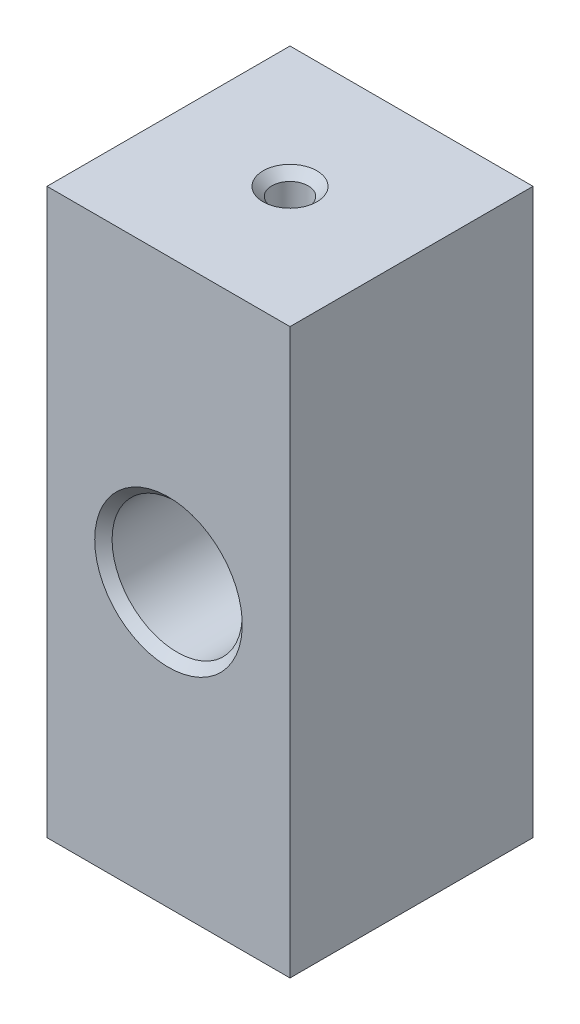
ISO-10303-21;
HEADER;
FILE_DESCRIPTION(('STEP AP214'),'2;1');
FILE_NAME('part.step','',(''),(''),'','','');
FILE_SCHEMA(('AUTOMOTIVE_DESIGN { 1 0 10303 214 1 1 1 1 }'));
ENDSEC;
DATA;
#1=APPLICATION_CONTEXT('core data for automotive mechanical design processes');
#2=APPLICATION_PROTOCOL_DEFINITION('international standard','automotive_design',2000,#1);
#3=PRODUCT_CONTEXT('',#1,'mechanical');
#4=PRODUCT('Part','Part','',(#3));
#5=PRODUCT_RELATED_PRODUCT_CATEGORY('part','',(#4));
#6=PRODUCT_DEFINITION_FORMATION('','',#4);
#7=PRODUCT_DEFINITION_CONTEXT('part definition',#1,'design');
#8=PRODUCT_DEFINITION('design','',#6,#7);
#9=PRODUCT_DEFINITION_SHAPE('','',#8);
#10=(LENGTH_UNIT() NAMED_UNIT(*) SI_UNIT(.MILLI.,.METRE.));
#11=(NAMED_UNIT(*) PLANE_ANGLE_UNIT() SI_UNIT($,.RADIAN.));
#12=(NAMED_UNIT(*) SI_UNIT($,.STERADIAN.) SOLID_ANGLE_UNIT());
#13=UNCERTAINTY_MEASURE_WITH_UNIT(LENGTH_MEASURE(1.E-05),#10,'distance_accuracy_value','');
#14=(GEOMETRIC_REPRESENTATION_CONTEXT(3) GLOBAL_UNCERTAINTY_ASSIGNED_CONTEXT((#13)) GLOBAL_UNIT_ASSIGNED_CONTEXT((#10,
#11,#12)) REPRESENTATION_CONTEXT('',''));
#15=CARTESIAN_POINT('',(0.,0.,0.));
#16=DIRECTION('',(0.,0.,1.));
#17=DIRECTION('',(1.,0.,0.));
#18=AXIS2_PLACEMENT_3D('',#15,#16,#17);
#19=CARTESIAN_POINT('',(0.,0.,28.));
#20=DIRECTION('',(0.,0.,-1.));
#21=DIRECTION('',(-1.,0.,0.));
#22=AXIS2_PLACEMENT_3D('',#19,#20,#21);
#23=PLANE('',#22);
#24=CARTESIAN_POINT('',(14.,32.5,28.));
#25=DIRECTION('',(0.,0.,-1.));
#26=DIRECTION('',(-1.,0.,0.));
#27=AXIS2_PLACEMENT_3D('',#24,#25,#26);
#28=CIRCLE('',#27,8.49999999999999);
#29=CARTESIAN_POINT('',(5.50000000000001,32.5,28.));
#30=VERTEX_POINT('',#29);
#31=EDGE_CURVE('E54',#30,#30,#28,.T.);
#32=ORIENTED_EDGE('',*,*,#31,.T.);
#33=EDGE_LOOP('',(#32));
#34=FACE_BOUND('',#33,.T.);
#35=DIRECTION('',(0.,-1.,0.));
#36=VECTOR('',#35,1.);
#37=CARTESIAN_POINT('',(0.,0.,28.));
#38=LINE('',#37,#36);
#39=CARTESIAN_POINT('',(0.,65.,28.));
#40=VERTEX_POINT('',#39);
#41=CARTESIAN_POINT('',(0.,0.,28.));
#42=VERTEX_POINT('',#41);
#43=EDGE_CURVE('E120',#40,#42,#38,.T.);
#44=ORIENTED_EDGE('',*,*,#43,.T.);
#45=DIRECTION('',(1.,0.,0.));
#46=VECTOR('',#45,1.);
#47=CARTESIAN_POINT('',(0.,0.,28.));
#48=LINE('',#47,#46);
#49=CARTESIAN_POINT('',(28.,0.,28.));
#50=VERTEX_POINT('',#49);
#51=EDGE_CURVE('E92',#42,#50,#48,.T.);
#52=ORIENTED_EDGE('',*,*,#51,.T.);
#53=DIRECTION('',(0.,1.,0.));
#54=VECTOR('',#53,1.);
#55=CARTESIAN_POINT('',(28.,0.,28.));
#56=LINE('',#55,#54);
#57=CARTESIAN_POINT('',(28.,65.,28.));
#58=VERTEX_POINT('',#57);
#59=EDGE_CURVE('E122',#50,#58,#56,.T.);
#60=ORIENTED_EDGE('',*,*,#59,.T.);
#61=DIRECTION('',(-1.,0.,0.));
#62=VECTOR('',#61,1.);
#63=CARTESIAN_POINT('',(0.,65.,28.));
#64=LINE('',#63,#62);
#65=EDGE_CURVE('E65',#58,#40,#64,.T.);
#66=ORIENTED_EDGE('',*,*,#65,.T.);
#67=EDGE_LOOP('',(#44,#52,#60,#66));
#68=FACE_BOUND('',#67,.T.);
#69=ADVANCED_FACE('F44',(#34,#68),#23,.F.);
#70=CARTESIAN_POINT('',(0.,0.,0.));
#71=DIRECTION('',(0.,0.,-1.));
#72=DIRECTION('',(-1.,0.,0.));
#73=AXIS2_PLACEMENT_3D('',#70,#71,#72);
#74=PLANE('',#73);
#75=CARTESIAN_POINT('',(14.,32.5,0.));
#76=DIRECTION('',(0.,0.,-1.));
#77=DIRECTION('',(-1.,0.,0.));
#78=AXIS2_PLACEMENT_3D('',#75,#76,#77);
#79=CIRCLE('',#78,8.49999999999999);
#80=CARTESIAN_POINT('',(5.50000000000001,32.5,0.));
#81=VERTEX_POINT('',#80);
#82=EDGE_CURVE('E11',#81,#81,#79,.F.);
#83=ORIENTED_EDGE('',*,*,#82,.T.);
#84=EDGE_LOOP('',(#83));
#85=FACE_BOUND('',#84,.T.);
#86=DIRECTION('',(0.,-1.,0.));
#87=VECTOR('',#86,1.);
#88=CARTESIAN_POINT('',(0.,0.,0.));
#89=LINE('',#88,#87);
#90=CARTESIAN_POINT('',(0.,65.,0.));
#91=VERTEX_POINT('',#90);
#92=CARTESIAN_POINT('',(0.,0.,0.));
#93=VERTEX_POINT('',#92);
#94=EDGE_CURVE('E113',#91,#93,#89,.T.);
#95=ORIENTED_EDGE('',*,*,#94,.F.);
#96=DIRECTION('',(-1.,0.,0.));
#97=VECTOR('',#96,1.);
#98=CARTESIAN_POINT('',(0.,65.,0.));
#99=LINE('',#98,#97);
#100=CARTESIAN_POINT('',(28.,65.,0.));
#101=VERTEX_POINT('',#100);
#102=EDGE_CURVE('E87',#101,#91,#99,.T.);
#103=ORIENTED_EDGE('',*,*,#102,.F.);
#104=DIRECTION('',(0.,1.,0.));
#105=VECTOR('',#104,1.);
#106=CARTESIAN_POINT('',(28.,0.,0.));
#107=LINE('',#106,#105);
#108=CARTESIAN_POINT('',(28.,0.,0.));
#109=VERTEX_POINT('',#108);
#110=EDGE_CURVE('E82',#109,#101,#107,.T.);
#111=ORIENTED_EDGE('',*,*,#110,.F.);
#112=DIRECTION('',(1.,0.,0.));
#113=VECTOR('',#112,1.);
#114=CARTESIAN_POINT('',(0.,0.,0.));
#115=LINE('',#114,#113);
#116=EDGE_CURVE('E130',#93,#109,#115,.T.);
#117=ORIENTED_EDGE('',*,*,#116,.F.);
#118=EDGE_LOOP('',(#95,#103,#111,#117));
#119=FACE_BOUND('',#118,.T.);
#120=ADVANCED_FACE('F180',(#85,#119),#74,.T.);
#121=CARTESIAN_POINT('',(0.,0.,28.));
#122=DIRECTION('',(1.,0.,0.));
#123=DIRECTION('',(0.,0.,-1.));
#124=AXIS2_PLACEMENT_3D('',#121,#122,#123);
#125=PLANE('',#124);
#126=ORIENTED_EDGE('',*,*,#94,.T.);
#127=DIRECTION('',(0.,0.,-1.));
#128=VECTOR('',#127,1.);
#129=CARTESIAN_POINT('',(0.,0.,28.));
#130=LINE('',#129,#128);
#131=EDGE_CURVE('E137',#42,#93,#130,.T.);
#132=ORIENTED_EDGE('',*,*,#131,.F.);
#133=ORIENTED_EDGE('',*,*,#43,.F.);
#134=DIRECTION('',(0.,0.,-1.));
#135=VECTOR('',#134,1.);
#136=CARTESIAN_POINT('',(0.,65.,28.));
#137=LINE('',#136,#135);
#138=EDGE_CURVE('E124',#40,#91,#137,.T.);
#139=ORIENTED_EDGE('',*,*,#138,.T.);
#140=EDGE_LOOP('',(#126,#132,#133,#139));
#141=FACE_BOUND('',#140,.T.);
#142=ADVANCED_FACE('F176',(#141),#125,.F.);
#143=CARTESIAN_POINT('',(0.,0.,28.));
#144=DIRECTION('',(0.,1.,0.));
#145=DIRECTION('',(0.,0.,1.));
#146=AXIS2_PLACEMENT_3D('',#143,#144,#145);
#147=PLANE('',#146);
#148=CARTESIAN_POINT('',(14.,0.,11.));
#149=DIRECTION('',(0.,1.,0.));
#150=DIRECTION('',(0.,0.,1.));
#151=AXIS2_PLACEMENT_3D('',#148,#149,#150);
#152=CIRCLE('',#151,3.09999999999999);
#153=CARTESIAN_POINT('',(14.,0.,14.1));
#154=VERTEX_POINT('',#153);
#155=EDGE_CURVE('E143',#154,#154,#152,.T.);
#156=ORIENTED_EDGE('',*,*,#155,.T.);
#157=EDGE_LOOP('',(#156));
#158=FACE_BOUND('',#157,.T.);
#159=ORIENTED_EDGE('',*,*,#116,.T.);
#160=DIRECTION('',(0.,0.,-1.));
#161=VECTOR('',#160,1.);
#162=CARTESIAN_POINT('',(28.,0.,28.));
#163=LINE('',#162,#161);
#164=EDGE_CURVE('E133',#50,#109,#163,.T.);
#165=ORIENTED_EDGE('',*,*,#164,.F.);
#166=ORIENTED_EDGE('',*,*,#51,.F.);
#167=ORIENTED_EDGE('',*,*,#131,.T.);
#168=EDGE_LOOP('',(#159,#165,#166,#167));
#169=FACE_BOUND('',#168,.T.);
#170=ADVANCED_FACE('F190',(#158,#169),#147,.F.);
#171=CARTESIAN_POINT('',(28.,0.,28.));
#172=DIRECTION('',(-1.,0.,0.));
#173=DIRECTION('',(0.,0.,1.));
#174=AXIS2_PLACEMENT_3D('',#171,#172,#173);
#175=PLANE('',#174);
#176=ORIENTED_EDGE('',*,*,#110,.T.);
#177=DIRECTION('',(0.,0.,-1.));
#178=VECTOR('',#177,1.);
#179=CARTESIAN_POINT('',(28.,65.,28.));
#180=LINE('',#179,#178);
#181=EDGE_CURVE('E131',#58,#101,#180,.T.);
#182=ORIENTED_EDGE('',*,*,#181,.F.);
#183=ORIENTED_EDGE('',*,*,#59,.F.);
#184=ORIENTED_EDGE('',*,*,#164,.T.);
#185=EDGE_LOOP('',(#176,#182,#183,#184));
#186=FACE_BOUND('',#185,.T.);
#187=ADVANCED_FACE('F186',(#186),#175,.F.);
#188=CARTESIAN_POINT('',(0.,65.,28.));
#189=DIRECTION('',(0.,-1.,0.));
#190=DIRECTION('',(0.,0.,-1.));
#191=AXIS2_PLACEMENT_3D('',#188,#189,#190);
#192=PLANE('',#191);
#193=CARTESIAN_POINT('',(14.,65.,14.));
#194=DIRECTION('',(0.,-1.,0.));
#195=DIRECTION('',(0.,0.,-1.));
#196=AXIS2_PLACEMENT_3D('',#193,#194,#195);
#197=CIRCLE('',#196,3.1);
#198=CARTESIAN_POINT('',(14.,65.,10.9));
#199=VERTEX_POINT('',#198);
#200=EDGE_CURVE('E150',#199,#199,#197,.T.);
#201=ORIENTED_EDGE('',*,*,#200,.T.);
#202=EDGE_LOOP('',(#201));
#203=FACE_BOUND('',#202,.T.);
#204=ORIENTED_EDGE('',*,*,#102,.T.);
#205=ORIENTED_EDGE('',*,*,#138,.F.);
#206=ORIENTED_EDGE('',*,*,#65,.F.);
#207=ORIENTED_EDGE('',*,*,#181,.T.);
#208=EDGE_LOOP('',(#204,#205,#206,#207));
#209=FACE_BOUND('',#208,.T.);
#210=ADVANCED_FACE('F166',(#203,#209),#192,.F.);
#211=CARTESIAN_POINT('',(14.,32.5,28.));
#212=DIRECTION('',(0.,0.,-1.));
#213=DIRECTION('',(-1.,0.,0.));
#214=AXIS2_PLACEMENT_3D('',#211,#212,#213);
#215=CYLINDRICAL_SURFACE('',#214,7.5);
#216=CARTESIAN_POINT('',(14.,32.5,27.));
#217=DIRECTION('',(0.,0.,-1.));
#218=DIRECTION('',(-1.,0.,0.));
#219=AXIS2_PLACEMENT_3D('',#216,#217,#218);
#220=CIRCLE('',#219,7.5);
#221=CARTESIAN_POINT('',(6.5,32.5,27.));
#222=VERTEX_POINT('',#221);
#223=EDGE_CURVE('E153',#222,#222,#220,.F.);
#224=ORIENTED_EDGE('',*,*,#223,.T.);
#225=EDGE_LOOP('',(#224));
#226=FACE_BOUND('',#225,.T.);
#227=CARTESIAN_POINT('',(14.,32.5,0.999999999999997));
#228=DIRECTION('',(0.,0.,-1.));
#229=DIRECTION('',(-1.,0.,0.));
#230=AXIS2_PLACEMENT_3D('',#227,#228,#229);
#231=CIRCLE('',#230,7.5);
#232=CARTESIAN_POINT('',(6.5,32.5,0.999999999999997));
#233=VERTEX_POINT('',#232);
#234=EDGE_CURVE('E147',#233,#233,#231,.T.);
#235=ORIENTED_EDGE('',*,*,#234,.T.);
#236=EDGE_LOOP('',(#235));
#237=FACE_BOUND('',#236,.T.);
#238=ADVANCED_FACE('F164',(#226,#237),#215,.F.);
#239=CARTESIAN_POINT('',(14.,18.7381927000421,11.));
#240=DIRECTION('',(0.,-1.,0.));
#241=DIRECTION('',(0.,0.,-1.));
#242=AXIS2_PLACEMENT_3D('',#239,#240,#241);
#243=CONICAL_SURFACE('',#242,2.1,1.02974425867665);
#244=CARTESIAN_POINT('',(14.,20.,11.));
#245=VERTEX_POINT('',#244);
#246=VERTEX_LOOP('',#245);
#247=FACE_BOUND('',#246,.T.);
#248=CARTESIAN_POINT('',(14.,18.7381927000421,11.));
#249=DIRECTION('',(0.,-1.,0.));
#250=DIRECTION('',(0.,0.,-1.));
#251=AXIS2_PLACEMENT_3D('',#248,#249,#250);
#252=CIRCLE('',#251,2.1);
#253=CARTESIAN_POINT('',(14.,18.7381927000421,8.9));
#254=VERTEX_POINT('',#253);
#255=EDGE_CURVE('E115',#254,#254,#252,.T.);
#256=ORIENTED_EDGE('',*,*,#255,.T.);
#257=EDGE_LOOP('',(#256));
#258=FACE_BOUND('',#257,.T.);
#259=ADVANCED_FACE('F169',(#247,#258),#243,.F.);
#260=CARTESIAN_POINT('',(14.,0.,11.));
#261=DIRECTION('',(0.,-1.,0.));
#262=DIRECTION('',(0.,0.,-1.));
#263=AXIS2_PLACEMENT_3D('',#260,#261,#262);
#264=CYLINDRICAL_SURFACE('',#263,2.09999999999999);
#265=CARTESIAN_POINT('',(14.,1.,11.));
#266=DIRECTION('',(0.,1.,0.));
#267=DIRECTION('',(0.,0.,1.));
#268=AXIS2_PLACEMENT_3D('',#265,#266,#267);
#269=CIRCLE('',#268,2.09999999999999);
#270=CARTESIAN_POINT('',(14.,1.,13.1));
#271=VERTEX_POINT('',#270);
#272=EDGE_CURVE('E138',#271,#271,#269,.F.);
#273=ORIENTED_EDGE('',*,*,#272,.T.);
#274=EDGE_LOOP('',(#273));
#275=FACE_BOUND('',#274,.T.);
#276=ORIENTED_EDGE('',*,*,#255,.F.);
#277=EDGE_LOOP('',(#276));
#278=FACE_BOUND('',#277,.T.);
#279=ADVANCED_FACE('F106',(#275,#278),#264,.F.);
#280=CARTESIAN_POINT('',(14.,46.2618072999579,14.));
#281=DIRECTION('',(0.,1.,0.));
#282=DIRECTION('',(0.,0.,1.));
#283=AXIS2_PLACEMENT_3D('',#280,#281,#282);
#284=CONICAL_SURFACE('',#283,2.1,1.02974425867665);
#285=CARTESIAN_POINT('',(14.,45.,14.));
#286=VERTEX_POINT('',#285);
#287=VERTEX_LOOP('',#286);
#288=FACE_BOUND('',#287,.T.);
#289=CARTESIAN_POINT('',(14.,46.2618072999579,14.));
#290=DIRECTION('',(0.,1.,0.));
#291=DIRECTION('',(0.,0.,1.));
#292=AXIS2_PLACEMENT_3D('',#289,#290,#291);
#293=CIRCLE('',#292,2.1);
#294=CARTESIAN_POINT('',(14.,46.2618072999579,16.1));
#295=VERTEX_POINT('',#294);
#296=EDGE_CURVE('E109',#295,#295,#293,.T.);
#297=ORIENTED_EDGE('',*,*,#296,.T.);
#298=EDGE_LOOP('',(#297));
#299=FACE_BOUND('',#298,.T.);
#300=ADVANCED_FACE('F105',(#288,#299),#284,.F.);
#301=CARTESIAN_POINT('',(14.,65.,14.));
#302=DIRECTION('',(0.,1.,0.));
#303=DIRECTION('',(0.,0.,1.));
#304=AXIS2_PLACEMENT_3D('',#301,#302,#303);
#305=CYLINDRICAL_SURFACE('',#304,2.09999999999999);
#306=CARTESIAN_POINT('',(14.,64.,14.));
#307=DIRECTION('',(0.,-1.,0.));
#308=DIRECTION('',(0.,0.,-1.));
#309=AXIS2_PLACEMENT_3D('',#306,#307,#308);
#310=CIRCLE('',#309,2.09999999999999);
#311=CARTESIAN_POINT('',(14.,64.,11.9));
#312=VERTEX_POINT('',#311);
#313=EDGE_CURVE('E145',#312,#312,#310,.F.);
#314=ORIENTED_EDGE('',*,*,#313,.T.);
#315=EDGE_LOOP('',(#314));
#316=FACE_BOUND('',#315,.T.);
#317=ORIENTED_EDGE('',*,*,#296,.F.);
#318=EDGE_LOOP('',(#317));
#319=FACE_BOUND('',#318,.T.);
#320=ADVANCED_FACE('F104',(#316,#319),#305,.F.);
#321=CARTESIAN_POINT('',(14.,1.,11.));
#322=DIRECTION('',(0.,-1.,0.));
#323=DIRECTION('',(0.,0.,-1.));
#324=AXIS2_PLACEMENT_3D('',#321,#322,#323);
#325=CONICAL_SURFACE('',#324,2.09999999999999,0.785398163397448);
#326=ORIENTED_EDGE('',*,*,#155,.F.);
#327=EDGE_LOOP('',(#326));
#328=FACE_BOUND('',#327,.T.);
#329=ORIENTED_EDGE('',*,*,#272,.F.);
#330=EDGE_LOOP('',(#329));
#331=FACE_BOUND('',#330,.T.);
#332=ADVANCED_FACE('F212',(#328,#331),#325,.F.);
#333=CARTESIAN_POINT('',(14.,64.,14.));
#334=DIRECTION('',(0.,1.,0.));
#335=DIRECTION('',(0.,0.,1.));
#336=AXIS2_PLACEMENT_3D('',#333,#334,#335);
#337=CONICAL_SURFACE('',#336,2.09999999999999,0.785398163397451);
#338=ORIENTED_EDGE('',*,*,#200,.F.);
#339=EDGE_LOOP('',(#338));
#340=FACE_BOUND('',#339,.T.);
#341=ORIENTED_EDGE('',*,*,#313,.F.);
#342=EDGE_LOOP('',(#341));
#343=FACE_BOUND('',#342,.T.);
#344=ADVANCED_FACE('F165',(#340,#343),#337,.F.);
#345=CARTESIAN_POINT('',(14.,32.5,27.));
#346=DIRECTION('',(0.,0.,1.));
#347=DIRECTION('',(1.,0.,0.));
#348=AXIS2_PLACEMENT_3D('',#345,#346,#347);
#349=CONICAL_SURFACE('',#348,7.5,0.785398163397448);
#350=ORIENTED_EDGE('',*,*,#31,.F.);
#351=EDGE_LOOP('',(#350));
#352=FACE_BOUND('',#351,.T.);
#353=ORIENTED_EDGE('',*,*,#223,.F.);
#354=EDGE_LOOP('',(#353));
#355=FACE_BOUND('',#354,.T.);
#356=ADVANCED_FACE('F157',(#352,#355),#349,.F.);
#357=CARTESIAN_POINT('',(14.,32.5,0.));
#358=DIRECTION('',(0.,0.,-1.));
#359=DIRECTION('',(-1.,0.,0.));
#360=AXIS2_PLACEMENT_3D('',#357,#358,#359);
#361=CONICAL_SURFACE('',#360,8.49999999999999,0.785398163397448);
#362=ORIENTED_EDGE('',*,*,#234,.F.);
#363=EDGE_LOOP('',(#362));
#364=FACE_BOUND('',#363,.T.);
#365=ORIENTED_EDGE('',*,*,#82,.F.);
#366=EDGE_LOOP('',(#365));
#367=FACE_BOUND('',#366,.T.);
#368=ADVANCED_FACE('F48',(#364,#367),#361,.F.);
#369=CLOSED_SHELL('',(#69,#120,#142,#170,#187,#210,#238,#259,#279,#300,#320,#332,#344,#356,#368));
#370=MANIFOLD_SOLID_BREP('B2',#369);
#371=ADVANCED_BREP_SHAPE_REPRESENTATION('',(#18,#370),#14);
#372=SHAPE_DEFINITION_REPRESENTATION(#9,#371);
ENDSEC;
END-ISO-10303-21;
